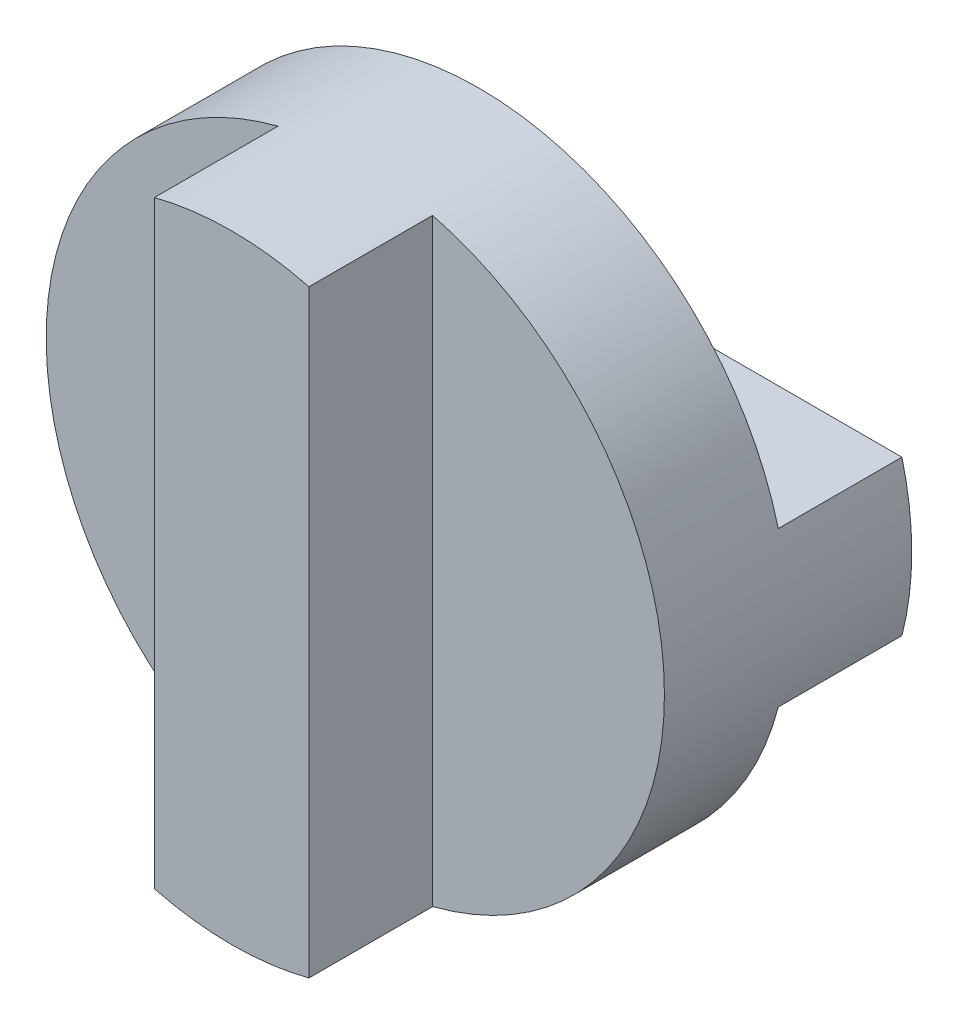
ISO-10303-21;
HEADER;
FILE_DESCRIPTION(('STEP AP214'),'2;1');
FILE_NAME('part.step','',(''),(''),'','','');
FILE_SCHEMA(('AUTOMOTIVE_DESIGN { 1 0 10303 214 1 1 1 1 }'));
ENDSEC;
DATA;
#1=APPLICATION_CONTEXT('core data for automotive mechanical design processes');
#2=APPLICATION_PROTOCOL_DEFINITION('international standard','automotive_design',2000,#1);
#3=PRODUCT_CONTEXT('',#1,'mechanical');
#4=PRODUCT('Part','Part','',(#3));
#5=PRODUCT_RELATED_PRODUCT_CATEGORY('part','',(#4));
#6=PRODUCT_DEFINITION_FORMATION('','',#4);
#7=PRODUCT_DEFINITION_CONTEXT('part definition',#1,'design');
#8=PRODUCT_DEFINITION('design','',#6,#7);
#9=PRODUCT_DEFINITION_SHAPE('','',#8);
#10=(LENGTH_UNIT() NAMED_UNIT(*) SI_UNIT(.MILLI.,.METRE.));
#11=(NAMED_UNIT(*) PLANE_ANGLE_UNIT() SI_UNIT($,.RADIAN.));
#12=(NAMED_UNIT(*) SI_UNIT($,.STERADIAN.) SOLID_ANGLE_UNIT());
#13=UNCERTAINTY_MEASURE_WITH_UNIT(LENGTH_MEASURE(1.E-05),#10,'distance_accuracy_value','');
#14=(GEOMETRIC_REPRESENTATION_CONTEXT(3) GLOBAL_UNCERTAINTY_ASSIGNED_CONTEXT((#13)) GLOBAL_UNIT_ASSIGNED_CONTEXT((#10,
#11,#12)) REPRESENTATION_CONTEXT('',''));
#15=CARTESIAN_POINT('',(0.,0.,0.));
#16=DIRECTION('',(0.,0.,1.));
#17=DIRECTION('',(1.,0.,0.));
#18=AXIS2_PLACEMENT_3D('',#15,#16,#17);
#19=CARTESIAN_POINT('',(0.,0.,5.08));
#20=DIRECTION('',(0.,0.,1.));
#21=DIRECTION('',(1.,0.,0.));
#22=AXIS2_PLACEMENT_3D('',#19,#20,#21);
#23=PLANE('',#22);
#24=DIRECTION('',(0.,1.,0.));
#25=VECTOR('',#24,1.);
#26=CARTESIAN_POINT('',(3.1749999999999,12.2967221242086,5.08));
#27=LINE('',#26,#25);
#28=CARTESIAN_POINT('',(3.17499999999999,-12.2967221242085,5.08));
#29=VERTEX_POINT('',#28);
#30=CARTESIAN_POINT('',(3.1749999999999,12.2967221242086,5.08));
#31=VERTEX_POINT('',#30);
#32=EDGE_CURVE('E49',#29,#31,#27,.T.);
#33=ORIENTED_EDGE('',*,*,#32,.F.);
#34=CARTESIAN_POINT('',(0.,0.,5.08));
#35=DIRECTION('',(0.,0.,1.));
#36=DIRECTION('',(1.,0.,0.));
#37=AXIS2_PLACEMENT_3D('',#34,#35,#36);
#38=CIRCLE('',#37,12.7);
#39=EDGE_CURVE('E42',#29,#31,#38,.T.);
#40=ORIENTED_EDGE('',*,*,#39,.T.);
#41=EDGE_LOOP('',(#33,#40));
#42=FACE_BOUND('',#41,.T.);
#43=ADVANCED_FACE('F33',(#42),#23,.T.);
#44=CARTESIAN_POINT('',(0.,0.,0.));
#45=DIRECTION('',(0.,0.,1.));
#46=DIRECTION('',(1.,0.,0.));
#47=AXIS2_PLACEMENT_3D('',#44,#45,#46);
#48=PLANE('',#47);
#49=DIRECTION('',(1.,0.,0.));
#50=VECTOR('',#49,1.);
#51=CARTESIAN_POINT('',(-12.2967221242086,3.175,0.));
#52=LINE('',#51,#50);
#53=CARTESIAN_POINT('',(-12.2967221242086,3.175,0.));
#54=VERTEX_POINT('',#53);
#55=CARTESIAN_POINT('',(12.2967221242086,3.175,0.));
#56=VERTEX_POINT('',#55);
#57=EDGE_CURVE('E123',#54,#56,#52,.T.);
#58=ORIENTED_EDGE('',*,*,#57,.F.);
#59=CARTESIAN_POINT('',(0.,0.,0.));
#60=DIRECTION('',(0.,0.,1.));
#61=DIRECTION('',(1.,0.,0.));
#62=AXIS2_PLACEMENT_3D('',#59,#60,#61);
#63=CIRCLE('',#62,12.7);
#64=EDGE_CURVE('E172',#56,#54,#63,.T.);
#65=ORIENTED_EDGE('',*,*,#64,.F.);
#66=EDGE_LOOP('',(#58,#65));
#67=FACE_BOUND('',#66,.T.);
#68=ADVANCED_FACE('F189',(#67),#48,.F.);
#69=DIRECTION('',(-1.,0.,0.));
#70=VECTOR('',#69,1.);
#71=CARTESIAN_POINT('',(12.2967221242085,-3.175,0.));
#72=LINE('',#71,#70);
#73=CARTESIAN_POINT('',(12.2967221242085,-3.175,0.));
#74=VERTEX_POINT('',#73);
#75=CARTESIAN_POINT('',(-12.2967221242085,-3.175,0.));
#76=VERTEX_POINT('',#75);
#77=EDGE_CURVE('E120',#74,#76,#72,.T.);
#78=ORIENTED_EDGE('',*,*,#77,.F.);
#79=EDGE_CURVE('E214',#76,#74,#63,.T.);
#80=ORIENTED_EDGE('',*,*,#79,.F.);
#81=EDGE_LOOP('',(#78,#80));
#82=FACE_BOUND('',#81,.T.);
#83=ADVANCED_FACE('F195',(#82),#48,.F.);
#84=CARTESIAN_POINT('',(0.,0.,5.08));
#85=DIRECTION('',(0.,0.,-1.));
#86=DIRECTION('',(-1.,0.,0.));
#87=AXIS2_PLACEMENT_3D('',#84,#85,#86);
#88=CYLINDRICAL_SURFACE('',#87,12.7);
#89=CARTESIAN_POINT('',(-3.1750000000001,12.2967221242086,5.08));
#90=VERTEX_POINT('',#89);
#91=CARTESIAN_POINT('',(-3.17500000000001,-12.2967221242085,5.08));
#92=VERTEX_POINT('',#91);
#93=EDGE_CURVE('E11',#90,#92,#38,.T.);
#94=ORIENTED_EDGE('',*,*,#93,.F.);
#95=DIRECTION('',(0.,0.,-1.));
#96=VECTOR('',#95,1.);
#97=CARTESIAN_POINT('',(-3.1750000000001,12.2967221242086,10.16));
#98=LINE('',#97,#96);
#99=CARTESIAN_POINT('',(-3.1750000000001,12.2967221242086,10.16));
#100=VERTEX_POINT('',#99);
#101=EDGE_CURVE('E103',#100,#90,#98,.T.);
#102=ORIENTED_EDGE('',*,*,#101,.F.);
#103=CARTESIAN_POINT('',(0.,0.,10.16));
#104=DIRECTION('',(0.,0.,1.));
#105=DIRECTION('',(-1.,0.,0.));
#106=AXIS2_PLACEMENT_3D('',#103,#104,#105);
#107=CIRCLE('',#106,12.7);
#108=CARTESIAN_POINT('',(3.1749999999999,12.2967221242086,10.16));
#109=VERTEX_POINT('',#108);
#110=EDGE_CURVE('E109',#109,#100,#107,.T.);
#111=ORIENTED_EDGE('',*,*,#110,.F.);
#112=DIRECTION('',(0.,0.,-1.));
#113=VECTOR('',#112,1.);
#114=CARTESIAN_POINT('',(3.1749999999999,12.2967221242086,10.16));
#115=LINE('',#114,#113);
#116=EDGE_CURVE('E134',#109,#31,#115,.T.);
#117=ORIENTED_EDGE('',*,*,#116,.T.);
#118=ORIENTED_EDGE('',*,*,#39,.F.);
#119=DIRECTION('',(0.,0.,-1.));
#120=VECTOR('',#119,1.);
#121=CARTESIAN_POINT('',(3.17499999999999,-12.2967221242085,10.16));
#122=LINE('',#121,#120);
#123=CARTESIAN_POINT('',(3.17499999999999,-12.2967221242085,10.16));
#124=VERTEX_POINT('',#123);
#125=EDGE_CURVE('E125',#124,#29,#122,.T.);
#126=ORIENTED_EDGE('',*,*,#125,.F.);
#127=CARTESIAN_POINT('',(0.,0.,10.16));
#128=DIRECTION('',(0.,0.,1.));
#129=DIRECTION('',(-1.,0.,0.));
#130=AXIS2_PLACEMENT_3D('',#127,#128,#129);
#131=CIRCLE('',#130,12.7);
#132=CARTESIAN_POINT('',(-3.17500000000001,-12.2967221242085,10.16));
#133=VERTEX_POINT('',#132);
#134=EDGE_CURVE('E108',#133,#124,#131,.T.);
#135=ORIENTED_EDGE('',*,*,#134,.F.);
#136=DIRECTION('',(0.,0.,-1.));
#137=VECTOR('',#136,1.);
#138=CARTESIAN_POINT('',(-3.17500000000001,-12.2967221242085,10.16));
#139=LINE('',#138,#137);
#140=EDGE_CURVE('E105',#133,#92,#139,.T.);
#141=ORIENTED_EDGE('',*,*,#140,.T.);
#142=EDGE_LOOP('',(#94,#102,#111,#117,#118,#126,#135,#141));
#143=FACE_BOUND('',#142,.T.);
#144=ORIENTED_EDGE('',*,*,#64,.T.);
#145=DIRECTION('',(0.,0.,1.));
#146=VECTOR('',#145,1.);
#147=CARTESIAN_POINT('',(-12.2967221242086,3.175,-31.2617207226721));
#148=LINE('',#147,#146);
#149=CARTESIAN_POINT('',(-12.2967221242086,3.175,-5.08));
#150=VERTEX_POINT('',#149);
#151=EDGE_CURVE('E159',#150,#54,#148,.T.);
#152=ORIENTED_EDGE('',*,*,#151,.F.);
#153=CARTESIAN_POINT('',(0.,0.,-5.08));
#154=DIRECTION('',(0.,0.,1.));
#155=DIRECTION('',(1.,0.,0.));
#156=AXIS2_PLACEMENT_3D('',#153,#154,#155);
#157=CIRCLE('',#156,12.7);
#158=CARTESIAN_POINT('',(-12.2967221242085,-3.175,-5.08));
#159=VERTEX_POINT('',#158);
#160=EDGE_CURVE('E227',#150,#159,#157,.T.);
#161=ORIENTED_EDGE('',*,*,#160,.T.);
#162=DIRECTION('',(0.,0.,1.));
#163=VECTOR('',#162,1.);
#164=CARTESIAN_POINT('',(-12.2967221242085,-3.175,-31.2617207226721));
#165=LINE('',#164,#163);
#166=EDGE_CURVE('E153',#159,#76,#165,.T.);
#167=ORIENTED_EDGE('',*,*,#166,.T.);
#168=ORIENTED_EDGE('',*,*,#79,.T.);
#169=DIRECTION('',(0.,0.,1.));
#170=VECTOR('',#169,1.);
#171=CARTESIAN_POINT('',(12.2967221242085,-3.175,-31.2617207226721));
#172=LINE('',#171,#170);
#173=CARTESIAN_POINT('',(12.2967221242085,-3.175,-5.08));
#174=VERTEX_POINT('',#173);
#175=EDGE_CURVE('E149',#174,#74,#172,.T.);
#176=ORIENTED_EDGE('',*,*,#175,.F.);
#177=CARTESIAN_POINT('',(0.,0.,-5.08));
#178=DIRECTION('',(0.,0.,1.));
#179=DIRECTION('',(1.,0.,0.));
#180=AXIS2_PLACEMENT_3D('',#177,#178,#179);
#181=CIRCLE('',#180,12.7);
#182=CARTESIAN_POINT('',(12.2967221242086,3.175,-5.08));
#183=VERTEX_POINT('',#182);
#184=EDGE_CURVE('E223',#174,#183,#181,.T.);
#185=ORIENTED_EDGE('',*,*,#184,.T.);
#186=DIRECTION('',(0.,0.,1.));
#187=VECTOR('',#186,1.);
#188=CARTESIAN_POINT('',(12.2967221242086,3.175,-31.2617207226721));
#189=LINE('',#188,#187);
#190=EDGE_CURVE('E156',#183,#56,#189,.T.);
#191=ORIENTED_EDGE('',*,*,#190,.T.);
#192=EDGE_LOOP('',(#144,#152,#161,#167,#168,#176,#185,#191));
#193=FACE_BOUND('',#192,.T.);
#194=ADVANCED_FACE('F35',(#143,#193),#88,.T.);
#195=DIRECTION('',(0.,-1.,0.));
#196=VECTOR('',#195,1.);
#197=CARTESIAN_POINT('',(-3.17500000000001,-12.2967221242085,5.08));
#198=LINE('',#197,#196);
#199=EDGE_CURVE('E55',#90,#92,#198,.T.);
#200=ORIENTED_EDGE('',*,*,#199,.F.);
#201=ORIENTED_EDGE('',*,*,#93,.T.);
#202=EDGE_LOOP('',(#200,#201));
#203=FACE_BOUND('',#202,.T.);
#204=ADVANCED_FACE('F191',(#203),#23,.T.);
#205=CARTESIAN_POINT('',(-12.2967221242086,3.175,-31.2617207226721));
#206=DIRECTION('',(0.,-1.,0.));
#207=DIRECTION('',(1.,0.,0.));
#208=AXIS2_PLACEMENT_3D('',#205,#206,#207);
#209=PLANE('',#208);
#210=ORIENTED_EDGE('',*,*,#190,.F.);
#211=DIRECTION('',(-1.,0.,0.));
#212=VECTOR('',#211,1.);
#213=CARTESIAN_POINT('',(-12.2967221242086,3.175,-5.08));
#214=LINE('',#213,#212);
#215=EDGE_CURVE('E152',#183,#150,#214,.T.);
#216=ORIENTED_EDGE('',*,*,#215,.T.);
#217=ORIENTED_EDGE('',*,*,#151,.T.);
#218=ORIENTED_EDGE('',*,*,#57,.T.);
#219=EDGE_LOOP('',(#210,#216,#217,#218));
#220=FACE_BOUND('',#219,.T.);
#221=ADVANCED_FACE('F199',(#220),#209,.F.);
#222=CARTESIAN_POINT('',(12.2967221242085,-3.175,-31.2617207226721));
#223=DIRECTION('',(0.,1.,0.));
#224=DIRECTION('',(-1.,0.,0.));
#225=AXIS2_PLACEMENT_3D('',#222,#223,#224);
#226=PLANE('',#225);
#227=ORIENTED_EDGE('',*,*,#166,.F.);
#228=DIRECTION('',(1.,0.,0.));
#229=VECTOR('',#228,1.);
#230=CARTESIAN_POINT('',(12.2967221242085,-3.175,-5.08));
#231=LINE('',#230,#229);
#232=EDGE_CURVE('E225',#159,#174,#231,.T.);
#233=ORIENTED_EDGE('',*,*,#232,.T.);
#234=ORIENTED_EDGE('',*,*,#175,.T.);
#235=ORIENTED_EDGE('',*,*,#77,.T.);
#236=EDGE_LOOP('',(#227,#233,#234,#235));
#237=FACE_BOUND('',#236,.T.);
#238=ADVANCED_FACE('F204',(#237),#226,.F.);
#239=CARTESIAN_POINT('',(0.,0.,-5.08));
#240=DIRECTION('',(0.,0.,1.));
#241=DIRECTION('',(1.,0.,0.));
#242=AXIS2_PLACEMENT_3D('',#239,#240,#241);
#243=PLANE('',#242);
#244=ORIENTED_EDGE('',*,*,#215,.F.);
#245=ORIENTED_EDGE('',*,*,#184,.F.);
#246=ORIENTED_EDGE('',*,*,#232,.F.);
#247=ORIENTED_EDGE('',*,*,#160,.F.);
#248=EDGE_LOOP('',(#244,#245,#246,#247));
#249=FACE_BOUND('',#248,.T.);
#250=ADVANCED_FACE('F186',(#249),#243,.F.);
#251=CARTESIAN_POINT('',(-3.17500000000001,-12.2967221242085,10.16));
#252=DIRECTION('',(1.,0.,0.));
#253=DIRECTION('',(0.,1.,0.));
#254=AXIS2_PLACEMENT_3D('',#251,#252,#253);
#255=PLANE('',#254);
#256=ORIENTED_EDGE('',*,*,#199,.T.);
#257=ORIENTED_EDGE('',*,*,#140,.F.);
#258=DIRECTION('',(0.,-1.,0.));
#259=VECTOR('',#258,1.);
#260=CARTESIAN_POINT('',(-3.17500000000001,-12.2967221242085,10.16));
#261=LINE('',#260,#259);
#262=EDGE_CURVE('E99',#100,#133,#261,.T.);
#263=ORIENTED_EDGE('',*,*,#262,.F.);
#264=ORIENTED_EDGE('',*,*,#101,.T.);
#265=EDGE_LOOP('',(#256,#257,#263,#264));
#266=FACE_BOUND('',#265,.T.);
#267=ADVANCED_FACE('F101',(#266),#255,.F.);
#268=CARTESIAN_POINT('',(3.1749999999999,12.2967221242086,10.16));
#269=DIRECTION('',(-1.,0.,0.));
#270=DIRECTION('',(0.,-1.,0.));
#271=AXIS2_PLACEMENT_3D('',#268,#269,#270);
#272=PLANE('',#271);
#273=ORIENTED_EDGE('',*,*,#32,.T.);
#274=ORIENTED_EDGE('',*,*,#116,.F.);
#275=DIRECTION('',(0.,1.,0.));
#276=VECTOR('',#275,1.);
#277=CARTESIAN_POINT('',(3.1749999999999,12.2967221242086,10.16));
#278=LINE('',#277,#276);
#279=EDGE_CURVE('E114',#124,#109,#278,.T.);
#280=ORIENTED_EDGE('',*,*,#279,.F.);
#281=ORIENTED_EDGE('',*,*,#125,.T.);
#282=EDGE_LOOP('',(#273,#274,#280,#281));
#283=FACE_BOUND('',#282,.T.);
#284=ADVANCED_FACE('F178',(#283),#272,.F.);
#285=CARTESIAN_POINT('',(0.,0.,10.16));
#286=DIRECTION('',(0.,0.,-1.));
#287=DIRECTION('',(-1.,0.,0.));
#288=AXIS2_PLACEMENT_3D('',#285,#286,#287);
#289=PLANE('',#288);
#290=ORIENTED_EDGE('',*,*,#110,.T.);
#291=ORIENTED_EDGE('',*,*,#262,.T.);
#292=ORIENTED_EDGE('',*,*,#134,.T.);
#293=ORIENTED_EDGE('',*,*,#279,.T.);
#294=EDGE_LOOP('',(#290,#291,#292,#293));
#295=FACE_BOUND('',#294,.T.);
#296=ADVANCED_FACE('F112',(#295),#289,.F.);
#297=CLOSED_SHELL('',(#43,#68,#83,#194,#204,#221,#238,#250,#267,#284,#296));
#298=MANIFOLD_SOLID_BREP('B2',#297);
#299=ADVANCED_BREP_SHAPE_REPRESENTATION('',(#18,#298),#14);
#300=SHAPE_DEFINITION_REPRESENTATION(#9,#299);
ENDSEC;
END-ISO-10303-21;
